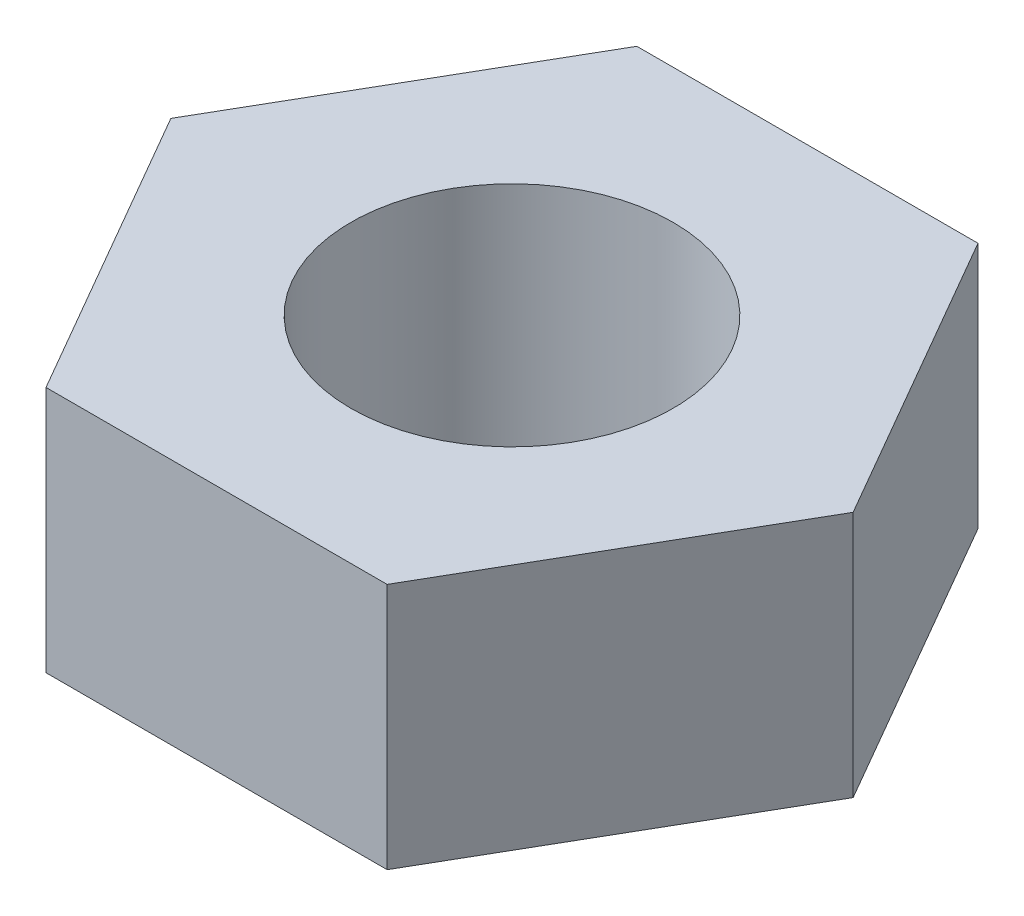
ISO-10303-21;
HEADER;
FILE_DESCRIPTION(('STEP AP214'),'2;1');
FILE_NAME('part.step','',(''),(''),'','','');
FILE_SCHEMA(('AUTOMOTIVE_DESIGN { 1 0 10303 214 1 1 1 1 }'));
ENDSEC;
DATA;
#1=APPLICATION_CONTEXT('core data for automotive mechanical design processes');
#2=APPLICATION_PROTOCOL_DEFINITION('international standard','automotive_design',2000,#1);
#3=PRODUCT_CONTEXT('',#1,'mechanical');
#4=PRODUCT('Part','Part','',(#3));
#5=PRODUCT_RELATED_PRODUCT_CATEGORY('part','',(#4));
#6=PRODUCT_DEFINITION_FORMATION('','',#4);
#7=PRODUCT_DEFINITION_CONTEXT('part definition',#1,'design');
#8=PRODUCT_DEFINITION('design','',#6,#7);
#9=PRODUCT_DEFINITION_SHAPE('','',#8);
#10=(LENGTH_UNIT() NAMED_UNIT(*) SI_UNIT(.MILLI.,.METRE.));
#11=(NAMED_UNIT(*) PLANE_ANGLE_UNIT() SI_UNIT($,.RADIAN.));
#12=(NAMED_UNIT(*) SI_UNIT($,.STERADIAN.) SOLID_ANGLE_UNIT());
#13=UNCERTAINTY_MEASURE_WITH_UNIT(LENGTH_MEASURE(1.E-05),#10,'distance_accuracy_value','');
#14=(GEOMETRIC_REPRESENTATION_CONTEXT(3) GLOBAL_UNCERTAINTY_ASSIGNED_CONTEXT((#13)) GLOBAL_UNIT_ASSIGNED_CONTEXT((#10,
#11,#12)) REPRESENTATION_CONTEXT('',''));
#15=CARTESIAN_POINT('',(0.,0.,0.));
#16=DIRECTION('',(0.,0.,1.));
#17=DIRECTION('',(1.,0.,0.));
#18=AXIS2_PLACEMENT_3D('',#15,#16,#17);
#19=CARTESIAN_POINT('',(0.,2.3,0.));
#20=DIRECTION('',(0.,1.,0.));
#21=DIRECTION('',(0.,0.,1.));
#22=AXIS2_PLACEMENT_3D('',#19,#20,#21);
#23=PLANE('',#22);
#24=DIRECTION('',(0.499999999999995,0.,-0.866025403784441));
#25=VECTOR('',#24,1.);
#26=CARTESIAN_POINT('',(1.5877132402715,2.3,2.74999999999997));
#27=LINE('',#26,#25);
#28=CARTESIAN_POINT('',(1.5877132402715,2.3,2.74999999999997));
#29=VERTEX_POINT('',#28);
#30=CARTESIAN_POINT('',(3.17542648054293,2.3,0.));
#31=VERTEX_POINT('',#30);
#32=EDGE_CURVE('E131',#29,#31,#27,.T.);
#33=ORIENTED_EDGE('',*,*,#32,.T.);
#34=DIRECTION('',(-0.500000000000001,0.,-0.866025403784438));
#35=VECTOR('',#34,1.);
#36=CARTESIAN_POINT('',(3.17542648054293,2.3,0.));
#37=LINE('',#36,#35);
#38=CARTESIAN_POINT('',(1.58771324027146,2.3,-2.74999999999999));
#39=VERTEX_POINT('',#38);
#40=EDGE_CURVE('E89',#31,#39,#37,.T.);
#41=ORIENTED_EDGE('',*,*,#40,.T.);
#42=DIRECTION('',(-1.,0.,0.));
#43=VECTOR('',#42,1.);
#44=CARTESIAN_POINT('',(1.58771324027146,2.3,-2.74999999999999));
#45=LINE('',#44,#43);
#46=CARTESIAN_POINT('',(-1.58771324027148,2.3,-2.74999999999998));
#47=VERTEX_POINT('',#46);
#48=EDGE_CURVE('E102',#39,#47,#45,.T.);
#49=ORIENTED_EDGE('',*,*,#48,.T.);
#50=DIRECTION('',(-0.499999999999995,0.,0.866025403784442));
#51=VECTOR('',#50,1.);
#52=CARTESIAN_POINT('',(-1.58771324027148,2.3,-2.74999999999998));
#53=LINE('',#52,#51);
#54=CARTESIAN_POINT('',(-3.17542648054293,2.3,0.));
#55=VERTEX_POINT('',#54);
#56=EDGE_CURVE('E96',#47,#55,#53,.T.);
#57=ORIENTED_EDGE('',*,*,#56,.T.);
#58=DIRECTION('',(0.500000000000007,0.,0.866025403784435));
#59=VECTOR('',#58,1.);
#60=CARTESIAN_POINT('',(-3.17542648054293,2.3,0.));
#61=LINE('',#60,#59);
#62=CARTESIAN_POINT('',(-1.58771324027144,2.3,2.75));
#63=VERTEX_POINT('',#62);
#64=EDGE_CURVE('E100',#55,#63,#61,.T.);
#65=ORIENTED_EDGE('',*,*,#64,.T.);
#66=DIRECTION('',(1.,0.,0.));
#67=VECTOR('',#66,1.);
#68=CARTESIAN_POINT('',(-1.58771324027144,2.3,2.75));
#69=LINE('',#68,#67);
#70=EDGE_CURVE('E52',#63,#29,#69,.T.);
#71=ORIENTED_EDGE('',*,*,#70,.T.);
#72=EDGE_LOOP('',(#33,#41,#49,#57,#65,#71));
#73=FACE_BOUND('',#72,.T.);
#74=CARTESIAN_POINT('',(0.,2.3,0.));
#75=DIRECTION('',(0.,1.,0.));
#76=DIRECTION('',(0.,0.,1.));
#77=AXIS2_PLACEMENT_3D('',#74,#75,#76);
#78=CIRCLE('',#77,1.5);
#79=CARTESIAN_POINT('',(0.,2.3,1.5));
#80=VERTEX_POINT('',#79);
#81=EDGE_CURVE('E124',#80,#80,#78,.T.);
#82=ORIENTED_EDGE('',*,*,#81,.F.);
#83=EDGE_LOOP('',(#82));
#84=FACE_BOUND('',#83,.T.);
#85=ADVANCED_FACE('F35',(#73,#84),#23,.T.);
#86=CARTESIAN_POINT('',(0.,0.,0.));
#87=DIRECTION('',(0.,1.,0.));
#88=DIRECTION('',(0.,0.,1.));
#89=AXIS2_PLACEMENT_3D('',#86,#87,#88);
#90=PLANE('',#89);
#91=DIRECTION('',(0.499999999999995,0.,-0.866025403784441));
#92=VECTOR('',#91,1.);
#93=CARTESIAN_POINT('',(1.5877132402715,0.,2.74999999999997));
#94=LINE('',#93,#92);
#95=CARTESIAN_POINT('',(1.5877132402715,0.,2.74999999999997));
#96=VERTEX_POINT('',#95);
#97=CARTESIAN_POINT('',(3.17542648054293,0.,0.));
#98=VERTEX_POINT('',#97);
#99=EDGE_CURVE('E120',#96,#98,#94,.T.);
#100=ORIENTED_EDGE('',*,*,#99,.F.);
#101=DIRECTION('',(1.,0.,0.));
#102=VECTOR('',#101,1.);
#103=CARTESIAN_POINT('',(-1.58771324027144,0.,2.75));
#104=LINE('',#103,#102);
#105=CARTESIAN_POINT('',(-1.58771324027144,0.,2.75));
#106=VERTEX_POINT('',#105);
#107=EDGE_CURVE('E81',#106,#96,#104,.T.);
#108=ORIENTED_EDGE('',*,*,#107,.F.);
#109=DIRECTION('',(0.500000000000007,0.,0.866025403784435));
#110=VECTOR('',#109,1.);
#111=CARTESIAN_POINT('',(-3.17542648054293,0.,0.));
#112=LINE('',#111,#110);
#113=CARTESIAN_POINT('',(-3.17542648054293,0.,0.));
#114=VERTEX_POINT('',#113);
#115=EDGE_CURVE('E75',#114,#106,#112,.T.);
#116=ORIENTED_EDGE('',*,*,#115,.F.);
#117=DIRECTION('',(-0.499999999999995,0.,0.866025403784442));
#118=VECTOR('',#117,1.);
#119=CARTESIAN_POINT('',(-1.58771324027148,0.,-2.74999999999998));
#120=LINE('',#119,#118);
#121=CARTESIAN_POINT('',(-1.58771324027148,0.,-2.74999999999998));
#122=VERTEX_POINT('',#121);
#123=EDGE_CURVE('E110',#122,#114,#120,.T.);
#124=ORIENTED_EDGE('',*,*,#123,.F.);
#125=DIRECTION('',(-1.,0.,0.));
#126=VECTOR('',#125,1.);
#127=CARTESIAN_POINT('',(1.58771324027146,0.,-2.74999999999999));
#128=LINE('',#127,#126);
#129=CARTESIAN_POINT('',(1.58771324027146,0.,-2.74999999999999));
#130=VERTEX_POINT('',#129);
#131=EDGE_CURVE('E126',#130,#122,#128,.T.);
#132=ORIENTED_EDGE('',*,*,#131,.F.);
#133=DIRECTION('',(-0.500000000000001,0.,-0.866025403784438));
#134=VECTOR('',#133,1.);
#135=CARTESIAN_POINT('',(3.17542648054293,0.,0.));
#136=LINE('',#135,#134);
#137=EDGE_CURVE('E123',#98,#130,#136,.T.);
#138=ORIENTED_EDGE('',*,*,#137,.F.);
#139=EDGE_LOOP('',(#100,#108,#116,#124,#132,#138));
#140=FACE_BOUND('',#139,.T.);
#141=CARTESIAN_POINT('',(0.,0.,0.));
#142=DIRECTION('',(0.,1.,0.));
#143=DIRECTION('',(0.,0.,1.));
#144=AXIS2_PLACEMENT_3D('',#141,#142,#143);
#145=CIRCLE('',#144,1.5);
#146=CARTESIAN_POINT('',(0.,0.,1.5));
#147=VERTEX_POINT('',#146);
#148=EDGE_CURVE('E224',#147,#147,#145,.T.);
#149=ORIENTED_EDGE('',*,*,#148,.T.);
#150=EDGE_LOOP('',(#149));
#151=FACE_BOUND('',#150,.T.);
#152=ADVANCED_FACE('F140',(#140,#151),#90,.F.);
#153=CARTESIAN_POINT('',(1.5877132402715,2.3,2.74999999999997));
#154=DIRECTION('',(-0.866025403784441,0.,-0.499999999999995));
#155=DIRECTION('',(-0.499999999999995,0.,0.866025403784441));
#156=AXIS2_PLACEMENT_3D('',#153,#154,#155);
#157=PLANE('',#156);
#158=ORIENTED_EDGE('',*,*,#99,.T.);
#159=DIRECTION('',(0.,-1.,0.));
#160=VECTOR('',#159,1.);
#161=CARTESIAN_POINT('',(3.17542648054293,2.3,0.));
#162=LINE('',#161,#160);
#163=EDGE_CURVE('E11',#31,#98,#162,.T.);
#164=ORIENTED_EDGE('',*,*,#163,.F.);
#165=ORIENTED_EDGE('',*,*,#32,.F.);
#166=DIRECTION('',(0.,-1.,0.));
#167=VECTOR('',#166,1.);
#168=CARTESIAN_POINT('',(1.5877132402715,2.3,2.74999999999997));
#169=LINE('',#168,#167);
#170=EDGE_CURVE('E116',#29,#96,#169,.T.);
#171=ORIENTED_EDGE('',*,*,#170,.T.);
#172=EDGE_LOOP('',(#158,#164,#165,#171));
#173=FACE_BOUND('',#172,.T.);
#174=ADVANCED_FACE('F37',(#173),#157,.F.);
#175=CARTESIAN_POINT('',(3.17542648054293,2.3,0.));
#176=DIRECTION('',(-0.866025403784438,0.,0.500000000000001));
#177=DIRECTION('',(0.500000000000001,0.,0.866025403784438));
#178=AXIS2_PLACEMENT_3D('',#175,#176,#177);
#179=PLANE('',#178);
#180=ORIENTED_EDGE('',*,*,#137,.T.);
#181=DIRECTION('',(0.,-1.,0.));
#182=VECTOR('',#181,1.);
#183=CARTESIAN_POINT('',(1.58771324027146,2.3,-2.74999999999999));
#184=LINE('',#183,#182);
#185=EDGE_CURVE('E44',#39,#130,#184,.T.);
#186=ORIENTED_EDGE('',*,*,#185,.F.);
#187=ORIENTED_EDGE('',*,*,#40,.F.);
#188=ORIENTED_EDGE('',*,*,#163,.T.);
#189=EDGE_LOOP('',(#180,#186,#187,#188));
#190=FACE_BOUND('',#189,.T.);
#191=ADVANCED_FACE('F165',(#190),#179,.F.);
#192=CARTESIAN_POINT('',(1.58771324027146,2.3,-2.74999999999999));
#193=DIRECTION('',(0.,0.,1.));
#194=DIRECTION('',(1.,0.,0.));
#195=AXIS2_PLACEMENT_3D('',#192,#193,#194);
#196=PLANE('',#195);
#197=ORIENTED_EDGE('',*,*,#131,.T.);
#198=DIRECTION('',(0.,-1.,0.));
#199=VECTOR('',#198,1.);
#200=CARTESIAN_POINT('',(-1.58771324027148,2.3,-2.74999999999998));
#201=LINE('',#200,#199);
#202=EDGE_CURVE('E111',#47,#122,#201,.T.);
#203=ORIENTED_EDGE('',*,*,#202,.F.);
#204=ORIENTED_EDGE('',*,*,#48,.F.);
#205=ORIENTED_EDGE('',*,*,#185,.T.);
#206=EDGE_LOOP('',(#197,#203,#204,#205));
#207=FACE_BOUND('',#206,.T.);
#208=ADVANCED_FACE('F137',(#207),#196,.F.);
#209=CARTESIAN_POINT('',(-1.58771324027148,2.3,-2.74999999999998));
#210=DIRECTION('',(0.866025403784442,0.,0.499999999999995));
#211=DIRECTION('',(0.499999999999995,0.,-0.866025403784442));
#212=AXIS2_PLACEMENT_3D('',#209,#210,#211);
#213=PLANE('',#212);
#214=ORIENTED_EDGE('',*,*,#123,.T.);
#215=DIRECTION('',(0.,-1.,0.));
#216=VECTOR('',#215,1.);
#217=CARTESIAN_POINT('',(-3.17542648054293,2.3,0.));
#218=LINE('',#217,#216);
#219=EDGE_CURVE('E107',#55,#114,#218,.T.);
#220=ORIENTED_EDGE('',*,*,#219,.F.);
#221=ORIENTED_EDGE('',*,*,#56,.F.);
#222=ORIENTED_EDGE('',*,*,#202,.T.);
#223=EDGE_LOOP('',(#214,#220,#221,#222));
#224=FACE_BOUND('',#223,.T.);
#225=ADVANCED_FACE('F108',(#224),#213,.F.);
#226=CARTESIAN_POINT('',(-3.17542648054293,2.3,0.));
#227=DIRECTION('',(0.866025403784435,0.,-0.500000000000007));
#228=DIRECTION('',(-0.500000000000007,0.,-0.866025403784435));
#229=AXIS2_PLACEMENT_3D('',#226,#227,#228);
#230=PLANE('',#229);
#231=ORIENTED_EDGE('',*,*,#115,.T.);
#232=DIRECTION('',(0.,-1.,0.));
#233=VECTOR('',#232,1.);
#234=CARTESIAN_POINT('',(-1.58771324027144,2.3,2.75));
#235=LINE('',#234,#233);
#236=EDGE_CURVE('E112',#63,#106,#235,.T.);
#237=ORIENTED_EDGE('',*,*,#236,.F.);
#238=ORIENTED_EDGE('',*,*,#64,.F.);
#239=ORIENTED_EDGE('',*,*,#219,.T.);
#240=EDGE_LOOP('',(#231,#237,#238,#239));
#241=FACE_BOUND('',#240,.T.);
#242=ADVANCED_FACE('F114',(#241),#230,.F.);
#243=CARTESIAN_POINT('',(-1.58771324027144,2.3,2.75));
#244=DIRECTION('',(0.,0.,-1.));
#245=DIRECTION('',(-1.,0.,0.));
#246=AXIS2_PLACEMENT_3D('',#243,#244,#245);
#247=PLANE('',#246);
#248=ORIENTED_EDGE('',*,*,#107,.T.);
#249=ORIENTED_EDGE('',*,*,#170,.F.);
#250=ORIENTED_EDGE('',*,*,#70,.F.);
#251=ORIENTED_EDGE('',*,*,#236,.T.);
#252=EDGE_LOOP('',(#248,#249,#250,#251));
#253=FACE_BOUND('',#252,.T.);
#254=ADVANCED_FACE('F145',(#253),#247,.F.);
#255=CARTESIAN_POINT('',(0.,2.3,0.));
#256=DIRECTION('',(0.,-1.,0.));
#257=DIRECTION('',(0.,0.,-1.));
#258=AXIS2_PLACEMENT_3D('',#255,#256,#257);
#259=CYLINDRICAL_SURFACE('',#258,1.5);
#260=ORIENTED_EDGE('',*,*,#81,.T.);
#261=EDGE_LOOP('',(#260));
#262=FACE_BOUND('',#261,.T.);
#263=ORIENTED_EDGE('',*,*,#148,.F.);
#264=EDGE_LOOP('',(#263));
#265=FACE_BOUND('',#264,.T.);
#266=ADVANCED_FACE('F147',(#262,#265),#259,.F.);
#267=CLOSED_SHELL('',(#85,#152,#174,#191,#208,#225,#242,#254,#266));
#268=MANIFOLD_SOLID_BREP('B2',#267);
#269=ADVANCED_BREP_SHAPE_REPRESENTATION('',(#18,#268),#14);
#270=SHAPE_DEFINITION_REPRESENTATION(#9,#269);
ENDSEC;
END-ISO-10303-21;
